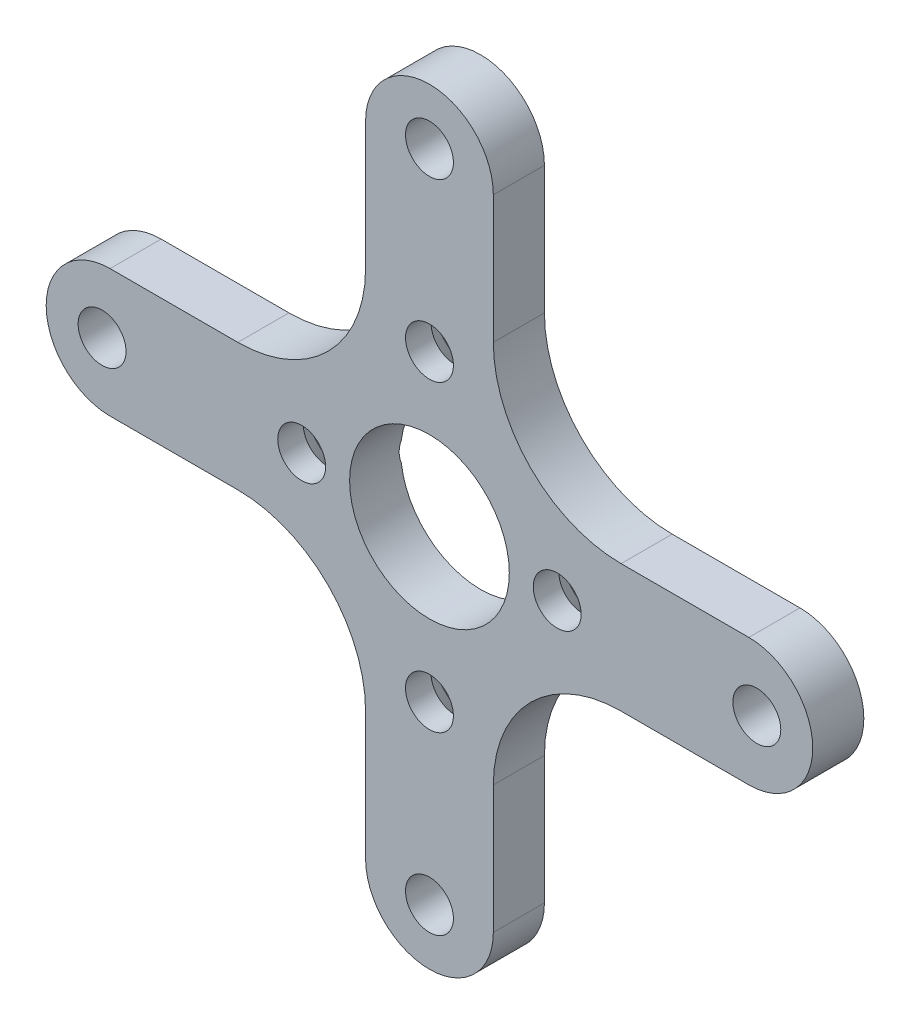
ISO-10303-21;
HEADER;
FILE_DESCRIPTION(('STEP AP214'),'2;1');
FILE_NAME('part.step','',(''),(''),'','','');
FILE_SCHEMA(('AUTOMOTIVE_DESIGN { 1 0 10303 214 1 1 1 1 }'));
ENDSEC;
DATA;
#1=APPLICATION_CONTEXT('core data for automotive mechanical design processes');
#2=APPLICATION_PROTOCOL_DEFINITION('international standard','automotive_design',2000,#1);
#3=PRODUCT_CONTEXT('',#1,'mechanical');
#4=PRODUCT('Part','Part','',(#3));
#5=PRODUCT_RELATED_PRODUCT_CATEGORY('part','',(#4));
#6=PRODUCT_DEFINITION_FORMATION('','',#4);
#7=PRODUCT_DEFINITION_CONTEXT('part definition',#1,'design');
#8=PRODUCT_DEFINITION('design','',#6,#7);
#9=PRODUCT_DEFINITION_SHAPE('','',#8);
#10=(LENGTH_UNIT() NAMED_UNIT(*) SI_UNIT(.MILLI.,.METRE.));
#11=(NAMED_UNIT(*) PLANE_ANGLE_UNIT() SI_UNIT($,.RADIAN.));
#12=(NAMED_UNIT(*) SI_UNIT($,.STERADIAN.) SOLID_ANGLE_UNIT());
#13=UNCERTAINTY_MEASURE_WITH_UNIT(LENGTH_MEASURE(1.E-05),#10,'distance_accuracy_value','');
#14=(GEOMETRIC_REPRESENTATION_CONTEXT(3) GLOBAL_UNCERTAINTY_ASSIGNED_CONTEXT((#13)) GLOBAL_UNIT_ASSIGNED_CONTEXT((#10,
#11,#12)) REPRESENTATION_CONTEXT('',''));
#15=CARTESIAN_POINT('',(0.,0.,0.));
#16=DIRECTION('',(0.,0.,1.));
#17=DIRECTION('',(1.,0.,0.));
#18=AXIS2_PLACEMENT_3D('',#15,#16,#17);
#19=CARTESIAN_POINT('',(0.,20.,3.2));
#20=DIRECTION('',(0.,0.,-1.));
#21=DIRECTION('',(-1.,0.,0.));
#22=AXIS2_PLACEMENT_3D('',#19,#20,#21);
#23=PLANE('',#22);
#24=CARTESIAN_POINT('',(0.,20.,3.2));
#25=DIRECTION('',(0.,0.,1.));
#26=DIRECTION('',(-1.,0.,0.));
#27=AXIS2_PLACEMENT_3D('',#24,#25,#26);
#28=CIRCLE('',#27,4.);
#29=CARTESIAN_POINT('',(4.,20.,3.2));
#30=VERTEX_POINT('',#29);
#31=CARTESIAN_POINT('',(-4.,20.,3.2));
#32=VERTEX_POINT('',#31);
#33=EDGE_CURVE('E172',#30,#32,#28,.T.);
#34=ORIENTED_EDGE('',*,*,#33,.T.);
#35=DIRECTION('',(0.,-1.,0.));
#36=VECTOR('',#35,1.);
#37=CARTESIAN_POINT('',(-4.,20.,3.2));
#38=LINE('',#37,#36);
#39=CARTESIAN_POINT('',(-4.,12.,3.2));
#40=VERTEX_POINT('',#39);
#41=EDGE_CURVE('E161',#32,#40,#38,.T.);
#42=ORIENTED_EDGE('',*,*,#41,.T.);
#43=CARTESIAN_POINT('',(-12.,12.,3.2));
#44=DIRECTION('',(0.,0.,-1.));
#45=DIRECTION('',(-1.,0.,0.));
#46=AXIS2_PLACEMENT_3D('',#43,#44,#45);
#47=CIRCLE('',#46,8.);
#48=CARTESIAN_POINT('',(-12.,4.,3.2));
#49=VERTEX_POINT('',#48);
#50=EDGE_CURVE('E171',#40,#49,#47,.T.);
#51=ORIENTED_EDGE('',*,*,#50,.T.);
#52=DIRECTION('',(-1.,0.,0.));
#53=VECTOR('',#52,1.);
#54=CARTESIAN_POINT('',(-12.,4.,3.2));
#55=LINE('',#54,#53);
#56=CARTESIAN_POINT('',(-20.,4.,3.2));
#57=VERTEX_POINT('',#56);
#58=EDGE_CURVE('E344',#49,#57,#55,.T.);
#59=ORIENTED_EDGE('',*,*,#58,.T.);
#60=CARTESIAN_POINT('',(-20.,0.,3.2));
#61=DIRECTION('',(0.,0.,1.));
#62=DIRECTION('',(1.,0.,0.));
#63=AXIS2_PLACEMENT_3D('',#60,#61,#62);
#64=CIRCLE('',#63,4.);
#65=CARTESIAN_POINT('',(-20.,-4.,3.2));
#66=VERTEX_POINT('',#65);
#67=EDGE_CURVE('E346',#57,#66,#64,.T.);
#68=ORIENTED_EDGE('',*,*,#67,.T.);
#69=DIRECTION('',(1.,0.,0.));
#70=VECTOR('',#69,1.);
#71=CARTESIAN_POINT('',(-20.,-4.,3.2));
#72=LINE('',#71,#70);
#73=CARTESIAN_POINT('',(-12.,-4.,3.2));
#74=VERTEX_POINT('',#73);
#75=EDGE_CURVE('E348',#66,#74,#72,.T.);
#76=ORIENTED_EDGE('',*,*,#75,.T.);
#77=CARTESIAN_POINT('',(-12.,-12.,3.2));
#78=DIRECTION('',(0.,0.,-1.));
#79=DIRECTION('',(-1.,0.,0.));
#80=AXIS2_PLACEMENT_3D('',#77,#78,#79);
#81=CIRCLE('',#80,8.);
#82=CARTESIAN_POINT('',(-4.,-12.,3.2));
#83=VERTEX_POINT('',#82);
#84=EDGE_CURVE('E350',#74,#83,#81,.T.);
#85=ORIENTED_EDGE('',*,*,#84,.T.);
#86=DIRECTION('',(0.,-1.,0.));
#87=VECTOR('',#86,1.);
#88=CARTESIAN_POINT('',(-4.,-12.,3.2));
#89=LINE('',#88,#87);
#90=CARTESIAN_POINT('',(-4.,-20.,3.2));
#91=VERTEX_POINT('',#90);
#92=EDGE_CURVE('E352',#83,#91,#89,.T.);
#93=ORIENTED_EDGE('',*,*,#92,.T.);
#94=CARTESIAN_POINT('',(0.,-20.,3.2));
#95=DIRECTION('',(0.,0.,1.));
#96=DIRECTION('',(1.,0.,0.));
#97=AXIS2_PLACEMENT_3D('',#94,#95,#96);
#98=CIRCLE('',#97,4.);
#99=CARTESIAN_POINT('',(4.,-20.,3.2));
#100=VERTEX_POINT('',#99);
#101=EDGE_CURVE('E354',#91,#100,#98,.T.);
#102=ORIENTED_EDGE('',*,*,#101,.T.);
#103=DIRECTION('',(0.,1.,0.));
#104=VECTOR('',#103,1.);
#105=CARTESIAN_POINT('',(4.,-20.,3.2));
#106=LINE('',#105,#104);
#107=CARTESIAN_POINT('',(4.00000000000001,-12.,3.2));
#108=VERTEX_POINT('',#107);
#109=EDGE_CURVE('E356',#100,#108,#106,.T.);
#110=ORIENTED_EDGE('',*,*,#109,.T.);
#111=CARTESIAN_POINT('',(12.,-12.,3.2));
#112=DIRECTION('',(0.,0.,-1.));
#113=DIRECTION('',(-1.,0.,0.));
#114=AXIS2_PLACEMENT_3D('',#111,#112,#113);
#115=CIRCLE('',#114,8.);
#116=CARTESIAN_POINT('',(12.,-4.,3.2));
#117=VERTEX_POINT('',#116);
#118=EDGE_CURVE('E358',#108,#117,#115,.T.);
#119=ORIENTED_EDGE('',*,*,#118,.T.);
#120=DIRECTION('',(1.,0.,0.));
#121=VECTOR('',#120,1.);
#122=CARTESIAN_POINT('',(12.,-4.,3.2));
#123=LINE('',#122,#121);
#124=CARTESIAN_POINT('',(20.,-4.,3.2));
#125=VERTEX_POINT('',#124);
#126=EDGE_CURVE('E360',#117,#125,#123,.T.);
#127=ORIENTED_EDGE('',*,*,#126,.T.);
#128=CARTESIAN_POINT('',(20.,0.,3.2));
#129=DIRECTION('',(0.,0.,1.));
#130=DIRECTION('',(-1.,0.,0.));
#131=AXIS2_PLACEMENT_3D('',#128,#129,#130);
#132=CIRCLE('',#131,4.);
#133=CARTESIAN_POINT('',(20.,4.,3.2));
#134=VERTEX_POINT('',#133);
#135=EDGE_CURVE('E362',#125,#134,#132,.T.);
#136=ORIENTED_EDGE('',*,*,#135,.T.);
#137=DIRECTION('',(-1.,0.,0.));
#138=VECTOR('',#137,1.);
#139=CARTESIAN_POINT('',(12.,4.,3.2));
#140=LINE('',#139,#138);
#141=CARTESIAN_POINT('',(12.,4.,3.2));
#142=VERTEX_POINT('',#141);
#143=EDGE_CURVE('E364',#134,#142,#140,.T.);
#144=ORIENTED_EDGE('',*,*,#143,.T.);
#145=CARTESIAN_POINT('',(12.,12.,3.2));
#146=DIRECTION('',(0.,0.,-1.));
#147=DIRECTION('',(1.,0.,0.));
#148=AXIS2_PLACEMENT_3D('',#145,#146,#147);
#149=CIRCLE('',#148,8.);
#150=CARTESIAN_POINT('',(4.,12.,3.2));
#151=VERTEX_POINT('',#150);
#152=EDGE_CURVE('E366',#142,#151,#149,.T.);
#153=ORIENTED_EDGE('',*,*,#152,.T.);
#154=DIRECTION('',(0.,1.,0.));
#155=VECTOR('',#154,1.);
#156=CARTESIAN_POINT('',(4.,20.,3.2));
#157=LINE('',#156,#155);
#158=EDGE_CURVE('E177',#151,#30,#157,.T.);
#159=ORIENTED_EDGE('',*,*,#158,.T.);
#160=EDGE_LOOP('',(#34,#42,#51,#59,#68,#76,#85,#93,#102,#110,#119,#127,#136,#144,#153,#159));
#161=FACE_BOUND('',#160,.T.);
#162=CARTESIAN_POINT('',(0.,20.5,3.2));
#163=DIRECTION('',(0.,0.,1.));
#164=DIRECTION('',(1.,0.,0.));
#165=AXIS2_PLACEMENT_3D('',#162,#163,#164);
#166=CIRCLE('',#165,1.5);
#167=CARTESIAN_POINT('',(1.5,20.5,3.2));
#168=VERTEX_POINT('',#167);
#169=EDGE_CURVE('E338',#168,#168,#166,.T.);
#170=ORIENTED_EDGE('',*,*,#169,.F.);
#171=EDGE_LOOP('',(#170));
#172=FACE_BOUND('',#171,.T.);
#173=CARTESIAN_POINT('',(20.5,0.,3.2));
#174=DIRECTION('',(0.,0.,1.));
#175=DIRECTION('',(1.,0.,0.));
#176=AXIS2_PLACEMENT_3D('',#173,#174,#175);
#177=CIRCLE('',#176,1.5);
#178=CARTESIAN_POINT('',(22.,0.,3.2));
#179=VERTEX_POINT('',#178);
#180=EDGE_CURVE('E332',#179,#179,#177,.T.);
#181=ORIENTED_EDGE('',*,*,#180,.F.);
#182=EDGE_LOOP('',(#181));
#183=FACE_BOUND('',#182,.T.);
#184=CARTESIAN_POINT('',(0.,0.,3.2));
#185=DIRECTION('',(0.,0.,1.));
#186=DIRECTION('',(1.,0.,0.));
#187=AXIS2_PLACEMENT_3D('',#184,#185,#186);
#188=CIRCLE('',#187,5.);
#189=CARTESIAN_POINT('',(5.,0.,3.2));
#190=VERTEX_POINT('',#189);
#191=EDGE_CURVE('E324',#190,#190,#188,.T.);
#192=ORIENTED_EDGE('',*,*,#191,.F.);
#193=EDGE_LOOP('',(#192));
#194=FACE_BOUND('',#193,.T.);
#195=CARTESIAN_POINT('',(0.,9.5,3.2));
#196=DIRECTION('',(0.,0.,1.));
#197=DIRECTION('',(1.,0.,0.));
#198=AXIS2_PLACEMENT_3D('',#195,#196,#197);
#199=CIRCLE('',#198,1.5);
#200=CARTESIAN_POINT('',(1.5,9.5,3.2));
#201=VERTEX_POINT('',#200);
#202=EDGE_CURVE('E329',#201,#201,#199,.T.);
#203=ORIENTED_EDGE('',*,*,#202,.F.);
#204=EDGE_LOOP('',(#203));
#205=FACE_BOUND('',#204,.T.);
#206=CARTESIAN_POINT('',(0.,-9.5,3.2));
#207=DIRECTION('',(0.,0.,1.));
#208=DIRECTION('',(1.,0.,0.));
#209=AXIS2_PLACEMENT_3D('',#206,#207,#208);
#210=CIRCLE('',#209,1.5);
#211=CARTESIAN_POINT('',(1.5,-9.5,3.2));
#212=VERTEX_POINT('',#211);
#213=EDGE_CURVE('E492',#212,#212,#210,.T.);
#214=ORIENTED_EDGE('',*,*,#213,.F.);
#215=EDGE_LOOP('',(#214));
#216=FACE_BOUND('',#215,.T.);
#217=CARTESIAN_POINT('',(-8.,0.,3.2));
#218=DIRECTION('',(0.,0.,1.));
#219=DIRECTION('',(1.,0.,0.));
#220=AXIS2_PLACEMENT_3D('',#217,#218,#219);
#221=CIRCLE('',#220,1.5);
#222=CARTESIAN_POINT('',(-6.5,0.,3.2));
#223=VERTEX_POINT('',#222);
#224=EDGE_CURVE('E496',#223,#223,#221,.T.);
#225=ORIENTED_EDGE('',*,*,#224,.F.);
#226=EDGE_LOOP('',(#225));
#227=FACE_BOUND('',#226,.T.);
#228=CARTESIAN_POINT('',(8.,0.,3.2));
#229=DIRECTION('',(0.,0.,1.));
#230=DIRECTION('',(1.,0.,0.));
#231=AXIS2_PLACEMENT_3D('',#228,#229,#230);
#232=CIRCLE('',#231,1.5);
#233=CARTESIAN_POINT('',(9.5,0.,3.2));
#234=VERTEX_POINT('',#233);
#235=EDGE_CURVE('E500',#234,#234,#232,.T.);
#236=ORIENTED_EDGE('',*,*,#235,.F.);
#237=EDGE_LOOP('',(#236));
#238=FACE_BOUND('',#237,.T.);
#239=CARTESIAN_POINT('',(-20.5,0.,3.2));
#240=DIRECTION('',(0.,0.,1.));
#241=DIRECTION('',(1.,0.,0.));
#242=AXIS2_PLACEMENT_3D('',#239,#240,#241);
#243=CIRCLE('',#242,1.5);
#244=CARTESIAN_POINT('',(-19.,0.,3.2));
#245=VERTEX_POINT('',#244);
#246=EDGE_CURVE('E504',#245,#245,#243,.T.);
#247=ORIENTED_EDGE('',*,*,#246,.F.);
#248=EDGE_LOOP('',(#247));
#249=FACE_BOUND('',#248,.T.);
#250=CARTESIAN_POINT('',(0.,-20.5,3.2));
#251=DIRECTION('',(0.,0.,1.));
#252=DIRECTION('',(1.,0.,0.));
#253=AXIS2_PLACEMENT_3D('',#250,#251,#252);
#254=CIRCLE('',#253,1.5);
#255=CARTESIAN_POINT('',(1.5,-20.5,3.2));
#256=VERTEX_POINT('',#255);
#257=EDGE_CURVE('E507',#256,#256,#254,.T.);
#258=ORIENTED_EDGE('',*,*,#257,.F.);
#259=EDGE_LOOP('',(#258));
#260=FACE_BOUND('',#259,.T.);
#261=ADVANCED_FACE('F34',(#161,#172,#183,#194,#205,#216,#227,#238,#249,#260),#23,.F.);
#262=CARTESIAN_POINT('',(0.,20.,0.));
#263=DIRECTION('',(0.,0.,-1.));
#264=DIRECTION('',(-1.,0.,0.));
#265=AXIS2_PLACEMENT_3D('',#262,#263,#264);
#266=PLANE('',#265);
#267=CARTESIAN_POINT('',(0.,-9.5,0.));
#268=DIRECTION('',(0.,0.,-1.));
#269=DIRECTION('',(-1.,0.,0.));
#270=AXIS2_PLACEMENT_3D('',#267,#268,#269);
#271=CIRCLE('',#270,3.09999999999999);
#272=CARTESIAN_POINT('',(-3.09999999999999,-9.5,0.));
#273=VERTEX_POINT('',#272);
#274=EDGE_CURVE('E199',#273,#273,#271,.F.);
#275=ORIENTED_EDGE('',*,*,#274,.T.);
#276=EDGE_LOOP('',(#275));
#277=FACE_BOUND('',#276,.T.);
#278=CARTESIAN_POINT('',(0.,9.5,0.));
#279=DIRECTION('',(0.,0.,-1.));
#280=DIRECTION('',(-1.,0.,0.));
#281=AXIS2_PLACEMENT_3D('',#278,#279,#280);
#282=CIRCLE('',#281,3.09999999999999);
#283=CARTESIAN_POINT('',(-3.09999999999999,9.5,0.));
#284=VERTEX_POINT('',#283);
#285=EDGE_CURVE('E196',#284,#284,#282,.F.);
#286=ORIENTED_EDGE('',*,*,#285,.T.);
#287=EDGE_LOOP('',(#286));
#288=FACE_BOUND('',#287,.T.);
#289=CARTESIAN_POINT('',(-20.5,0.,0.));
#290=DIRECTION('',(0.,0.,1.));
#291=DIRECTION('',(1.,0.,0.));
#292=AXIS2_PLACEMENT_3D('',#289,#290,#291);
#293=CIRCLE('',#292,1.5);
#294=CARTESIAN_POINT('',(-19.,0.,0.));
#295=VERTEX_POINT('',#294);
#296=EDGE_CURVE('E509',#295,#295,#293,.T.);
#297=ORIENTED_EDGE('',*,*,#296,.T.);
#298=EDGE_LOOP('',(#297));
#299=FACE_BOUND('',#298,.T.);
#300=CARTESIAN_POINT('',(20.5,0.,0.));
#301=DIRECTION('',(0.,0.,1.));
#302=DIRECTION('',(1.,0.,0.));
#303=AXIS2_PLACEMENT_3D('',#300,#301,#302);
#304=CIRCLE('',#303,1.5);
#305=CARTESIAN_POINT('',(22.,0.,0.));
#306=VERTEX_POINT('',#305);
#307=EDGE_CURVE('E327',#306,#306,#304,.T.);
#308=ORIENTED_EDGE('',*,*,#307,.T.);
#309=EDGE_LOOP('',(#308));
#310=FACE_BOUND('',#309,.T.);
#311=CARTESIAN_POINT('',(0.,20.,0.));
#312=DIRECTION('',(0.,0.,1.));
#313=DIRECTION('',(-1.,0.,0.));
#314=AXIS2_PLACEMENT_3D('',#311,#312,#313);
#315=CIRCLE('',#314,4.);
#316=CARTESIAN_POINT('',(4.,20.,0.));
#317=VERTEX_POINT('',#316);
#318=CARTESIAN_POINT('',(-4.,20.,0.));
#319=VERTEX_POINT('',#318);
#320=EDGE_CURVE('E185',#317,#319,#315,.T.);
#321=ORIENTED_EDGE('',*,*,#320,.F.);
#322=DIRECTION('',(0.,1.,0.));
#323=VECTOR('',#322,1.);
#324=CARTESIAN_POINT('',(4.,20.,0.));
#325=LINE('',#324,#323);
#326=CARTESIAN_POINT('',(4.,12.,0.));
#327=VERTEX_POINT('',#326);
#328=EDGE_CURVE('E181',#327,#317,#325,.T.);
#329=ORIENTED_EDGE('',*,*,#328,.F.);
#330=CARTESIAN_POINT('',(12.,12.,0.));
#331=DIRECTION('',(0.,0.,-1.));
#332=DIRECTION('',(1.,0.,0.));
#333=AXIS2_PLACEMENT_3D('',#330,#331,#332);
#334=CIRCLE('',#333,8.);
#335=CARTESIAN_POINT('',(12.,4.,0.));
#336=VERTEX_POINT('',#335);
#337=EDGE_CURVE('E397',#336,#327,#334,.T.);
#338=ORIENTED_EDGE('',*,*,#337,.F.);
#339=DIRECTION('',(-1.,0.,0.));
#340=VECTOR('',#339,1.);
#341=CARTESIAN_POINT('',(12.,4.,0.));
#342=LINE('',#341,#340);
#343=CARTESIAN_POINT('',(20.,4.,0.));
#344=VERTEX_POINT('',#343);
#345=EDGE_CURVE('E395',#344,#336,#342,.T.);
#346=ORIENTED_EDGE('',*,*,#345,.F.);
#347=CARTESIAN_POINT('',(20.,0.,0.));
#348=DIRECTION('',(0.,0.,1.));
#349=DIRECTION('',(-1.,0.,0.));
#350=AXIS2_PLACEMENT_3D('',#347,#348,#349);
#351=CIRCLE('',#350,4.);
#352=CARTESIAN_POINT('',(20.,-4.,0.));
#353=VERTEX_POINT('',#352);
#354=EDGE_CURVE('E393',#353,#344,#351,.T.);
#355=ORIENTED_EDGE('',*,*,#354,.F.);
#356=DIRECTION('',(1.,0.,0.));
#357=VECTOR('',#356,1.);
#358=CARTESIAN_POINT('',(12.,-4.,0.));
#359=LINE('',#358,#357);
#360=CARTESIAN_POINT('',(12.,-4.,0.));
#361=VERTEX_POINT('',#360);
#362=EDGE_CURVE('E391',#361,#353,#359,.T.);
#363=ORIENTED_EDGE('',*,*,#362,.F.);
#364=CARTESIAN_POINT('',(12.,-12.,0.));
#365=DIRECTION('',(0.,0.,-1.));
#366=DIRECTION('',(-1.,0.,0.));
#367=AXIS2_PLACEMENT_3D('',#364,#365,#366);
#368=CIRCLE('',#367,8.);
#369=CARTESIAN_POINT('',(4.00000000000001,-12.,0.));
#370=VERTEX_POINT('',#369);
#371=EDGE_CURVE('E389',#370,#361,#368,.T.);
#372=ORIENTED_EDGE('',*,*,#371,.F.);
#373=DIRECTION('',(0.,1.,0.));
#374=VECTOR('',#373,1.);
#375=CARTESIAN_POINT('',(4.,-20.,0.));
#376=LINE('',#375,#374);
#377=CARTESIAN_POINT('',(4.,-20.,0.));
#378=VERTEX_POINT('',#377);
#379=EDGE_CURVE('E387',#378,#370,#376,.T.);
#380=ORIENTED_EDGE('',*,*,#379,.F.);
#381=CARTESIAN_POINT('',(0.,-20.,0.));
#382=DIRECTION('',(0.,0.,1.));
#383=DIRECTION('',(1.,0.,0.));
#384=AXIS2_PLACEMENT_3D('',#381,#382,#383);
#385=CIRCLE('',#384,4.);
#386=CARTESIAN_POINT('',(-4.,-20.,0.));
#387=VERTEX_POINT('',#386);
#388=EDGE_CURVE('E385',#387,#378,#385,.T.);
#389=ORIENTED_EDGE('',*,*,#388,.F.);
#390=DIRECTION('',(0.,-1.,0.));
#391=VECTOR('',#390,1.);
#392=CARTESIAN_POINT('',(-4.,-12.,0.));
#393=LINE('',#392,#391);
#394=CARTESIAN_POINT('',(-4.,-12.,0.));
#395=VERTEX_POINT('',#394);
#396=EDGE_CURVE('E383',#395,#387,#393,.T.);
#397=ORIENTED_EDGE('',*,*,#396,.F.);
#398=CARTESIAN_POINT('',(-12.,-12.,0.));
#399=DIRECTION('',(0.,0.,-1.));
#400=DIRECTION('',(-1.,0.,0.));
#401=AXIS2_PLACEMENT_3D('',#398,#399,#400);
#402=CIRCLE('',#401,8.);
#403=CARTESIAN_POINT('',(-12.,-4.,0.));
#404=VERTEX_POINT('',#403);
#405=EDGE_CURVE('E381',#404,#395,#402,.T.);
#406=ORIENTED_EDGE('',*,*,#405,.F.);
#407=DIRECTION('',(1.,0.,0.));
#408=VECTOR('',#407,1.);
#409=CARTESIAN_POINT('',(-20.,-4.,0.));
#410=LINE('',#409,#408);
#411=CARTESIAN_POINT('',(-20.,-4.,0.));
#412=VERTEX_POINT('',#411);
#413=EDGE_CURVE('E379',#412,#404,#410,.T.);
#414=ORIENTED_EDGE('',*,*,#413,.F.);
#415=CARTESIAN_POINT('',(-20.,0.,0.));
#416=DIRECTION('',(0.,0.,1.));
#417=DIRECTION('',(1.,0.,0.));
#418=AXIS2_PLACEMENT_3D('',#415,#416,#417);
#419=CIRCLE('',#418,4.);
#420=CARTESIAN_POINT('',(-20.,4.,0.));
#421=VERTEX_POINT('',#420);
#422=EDGE_CURVE('E377',#421,#412,#419,.T.);
#423=ORIENTED_EDGE('',*,*,#422,.F.);
#424=DIRECTION('',(-1.,0.,0.));
#425=VECTOR('',#424,1.);
#426=CARTESIAN_POINT('',(-12.,4.,0.));
#427=LINE('',#426,#425);
#428=CARTESIAN_POINT('',(-12.,4.,0.));
#429=VERTEX_POINT('',#428);
#430=EDGE_CURVE('E375',#429,#421,#427,.T.);
#431=ORIENTED_EDGE('',*,*,#430,.F.);
#432=CARTESIAN_POINT('',(-12.,12.,0.));
#433=DIRECTION('',(0.,0.,-1.));
#434=DIRECTION('',(-1.,0.,0.));
#435=AXIS2_PLACEMENT_3D('',#432,#433,#434);
#436=CIRCLE('',#435,8.);
#437=CARTESIAN_POINT('',(-4.,12.,0.));
#438=VERTEX_POINT('',#437);
#439=EDGE_CURVE('E373',#438,#429,#436,.T.);
#440=ORIENTED_EDGE('',*,*,#439,.F.);
#441=DIRECTION('',(0.,-1.,0.));
#442=VECTOR('',#441,1.);
#443=CARTESIAN_POINT('',(-4.,20.,0.));
#444=LINE('',#443,#442);
#445=EDGE_CURVE('E371',#319,#438,#444,.T.);
#446=ORIENTED_EDGE('',*,*,#445,.F.);
#447=EDGE_LOOP('',(#321,#329,#338,#346,#355,#363,#372,#380,#389,#397,#406,#414,#423,#431,#440,#446));
#448=FACE_BOUND('',#447,.T.);
#449=CARTESIAN_POINT('',(0.,20.5,0.));
#450=DIRECTION('',(0.,0.,1.));
#451=DIRECTION('',(1.,0.,0.));
#452=AXIS2_PLACEMENT_3D('',#449,#450,#451);
#453=CIRCLE('',#452,1.5);
#454=CARTESIAN_POINT('',(1.5,20.5,0.));
#455=VERTEX_POINT('',#454);
#456=EDGE_CURVE('E335',#455,#455,#453,.T.);
#457=ORIENTED_EDGE('',*,*,#456,.T.);
#458=EDGE_LOOP('',(#457));
#459=FACE_BOUND('',#458,.T.);
#460=CARTESIAN_POINT('',(0.,0.,0.));
#461=DIRECTION('',(0.,0.,1.));
#462=DIRECTION('',(1.,0.,0.));
#463=AXIS2_PLACEMENT_3D('',#460,#461,#462);
#464=CIRCLE('',#463,5.);
#465=CARTESIAN_POINT('',(4.96187499999999,0.616276305219592,0.));
#466=VERTEX_POINT('',#465);
#467=CARTESIAN_POINT('',(-4.961875,0.616276305219537,0.));
#468=VERTEX_POINT('',#467);
#469=EDGE_CURVE('E319',#466,#468,#464,.T.);
#470=ORIENTED_EDGE('',*,*,#469,.T.);
#471=CARTESIAN_POINT('',(-8.,0.,0.));
#472=DIRECTION('',(0.,0.,-1.));
#473=DIRECTION('',(-1.,0.,0.));
#474=AXIS2_PLACEMENT_3D('',#471,#472,#473);
#475=CIRCLE('',#474,3.10000000000001);
#476=CARTESIAN_POINT('',(-4.961875,-0.616276305219537,0.));
#477=VERTEX_POINT('',#476);
#478=EDGE_CURVE('E189',#468,#477,#475,.F.);
#479=ORIENTED_EDGE('',*,*,#478,.T.);
#480=CARTESIAN_POINT('',(4.96187499999999,-0.616276305219592,0.));
#481=VERTEX_POINT('',#480);
#482=EDGE_CURVE('E320',#477,#481,#464,.T.);
#483=ORIENTED_EDGE('',*,*,#482,.T.);
#484=CARTESIAN_POINT('',(8.,0.,0.));
#485=DIRECTION('',(0.,0.,-1.));
#486=DIRECTION('',(-1.,0.,0.));
#487=AXIS2_PLACEMENT_3D('',#484,#485,#486);
#488=CIRCLE('',#487,3.10000000000003);
#489=EDGE_CURVE('E186',#481,#466,#488,.F.);
#490=ORIENTED_EDGE('',*,*,#489,.T.);
#491=EDGE_LOOP('',(#470,#479,#483,#490));
#492=FACE_BOUND('',#491,.T.);
#493=CARTESIAN_POINT('',(0.,-20.5,0.));
#494=DIRECTION('',(0.,0.,1.));
#495=DIRECTION('',(1.,0.,0.));
#496=AXIS2_PLACEMENT_3D('',#493,#494,#495);
#497=CIRCLE('',#496,1.5);
#498=CARTESIAN_POINT('',(1.5,-20.5,0.));
#499=VERTEX_POINT('',#498);
#500=EDGE_CURVE('E510',#499,#499,#497,.T.);
#501=ORIENTED_EDGE('',*,*,#500,.T.);
#502=EDGE_LOOP('',(#501));
#503=FACE_BOUND('',#502,.T.);
#504=ADVANCED_FACE('F236',(#277,#288,#299,#310,#448,#459,#492,#503),#266,.T.);
#505=CARTESIAN_POINT('',(0.,20.,3.2));
#506=DIRECTION('',(0.,0.,-1.));
#507=DIRECTION('',(-1.,0.,0.));
#508=AXIS2_PLACEMENT_3D('',#505,#506,#507);
#509=CYLINDRICAL_SURFACE('',#508,4.);
#510=ORIENTED_EDGE('',*,*,#320,.T.);
#511=DIRECTION('',(0.,0.,-1.));
#512=VECTOR('',#511,1.);
#513=CARTESIAN_POINT('',(-4.,20.,3.2));
#514=LINE('',#513,#512);
#515=EDGE_CURVE('E165',#32,#319,#514,.T.);
#516=ORIENTED_EDGE('',*,*,#515,.F.);
#517=ORIENTED_EDGE('',*,*,#33,.F.);
#518=DIRECTION('',(0.,0.,-1.));
#519=VECTOR('',#518,1.);
#520=CARTESIAN_POINT('',(4.,20.,3.2));
#521=LINE('',#520,#519);
#522=EDGE_CURVE('E369',#30,#317,#521,.T.);
#523=ORIENTED_EDGE('',*,*,#522,.T.);
#524=EDGE_LOOP('',(#510,#516,#517,#523));
#525=FACE_BOUND('',#524,.T.);
#526=ADVANCED_FACE('F183',(#525),#509,.T.);
#527=CARTESIAN_POINT('',(-4.,20.,3.2));
#528=DIRECTION('',(1.,0.,0.));
#529=DIRECTION('',(0.,1.,0.));
#530=AXIS2_PLACEMENT_3D('',#527,#528,#529);
#531=PLANE('',#530);
#532=ORIENTED_EDGE('',*,*,#445,.T.);
#533=DIRECTION('',(0.,0.,-1.));
#534=VECTOR('',#533,1.);
#535=CARTESIAN_POINT('',(-4.,12.,3.2));
#536=LINE('',#535,#534);
#537=EDGE_CURVE('E168',#40,#438,#536,.T.);
#538=ORIENTED_EDGE('',*,*,#537,.F.);
#539=ORIENTED_EDGE('',*,*,#41,.F.);
#540=ORIENTED_EDGE('',*,*,#515,.T.);
#541=EDGE_LOOP('',(#532,#538,#539,#540));
#542=FACE_BOUND('',#541,.T.);
#543=ADVANCED_FACE('F163',(#542),#531,.F.);
#544=CARTESIAN_POINT('',(-12.,12.,3.2));
#545=DIRECTION('',(0.,0.,-1.));
#546=DIRECTION('',(-1.,0.,0.));
#547=AXIS2_PLACEMENT_3D('',#544,#545,#546);
#548=CYLINDRICAL_SURFACE('',#547,8.);
#549=ORIENTED_EDGE('',*,*,#439,.T.);
#550=DIRECTION('',(0.,0.,-1.));
#551=VECTOR('',#550,1.);
#552=CARTESIAN_POINT('',(-12.,4.,3.2));
#553=LINE('',#552,#551);
#554=EDGE_CURVE('E191',#49,#429,#553,.T.);
#555=ORIENTED_EDGE('',*,*,#554,.F.);
#556=ORIENTED_EDGE('',*,*,#50,.F.);
#557=ORIENTED_EDGE('',*,*,#537,.T.);
#558=EDGE_LOOP('',(#549,#555,#556,#557));
#559=FACE_BOUND('',#558,.T.);
#560=ADVANCED_FACE('F290',(#559),#548,.F.);
#561=CARTESIAN_POINT('',(-12.,4.,3.2));
#562=DIRECTION('',(0.,-1.,0.));
#563=DIRECTION('',(1.,0.,0.));
#564=AXIS2_PLACEMENT_3D('',#561,#562,#563);
#565=PLANE('',#564);
#566=ORIENTED_EDGE('',*,*,#430,.T.);
#567=DIRECTION('',(0.,0.,-1.));
#568=VECTOR('',#567,1.);
#569=CARTESIAN_POINT('',(-20.,4.,3.2));
#570=LINE('',#569,#568);
#571=EDGE_CURVE('E434',#57,#421,#570,.T.);
#572=ORIENTED_EDGE('',*,*,#571,.F.);
#573=ORIENTED_EDGE('',*,*,#58,.F.);
#574=ORIENTED_EDGE('',*,*,#554,.T.);
#575=EDGE_LOOP('',(#566,#572,#573,#574));
#576=FACE_BOUND('',#575,.T.);
#577=ADVANCED_FACE('F286',(#576),#565,.F.);
#578=CARTESIAN_POINT('',(-20.,0.,3.2));
#579=DIRECTION('',(0.,0.,-1.));
#580=DIRECTION('',(-1.,0.,0.));
#581=AXIS2_PLACEMENT_3D('',#578,#579,#580);
#582=CYLINDRICAL_SURFACE('',#581,4.);
#583=ORIENTED_EDGE('',*,*,#422,.T.);
#584=DIRECTION('',(0.,0.,-1.));
#585=VECTOR('',#584,1.);
#586=CARTESIAN_POINT('',(-20.,-4.,3.2));
#587=LINE('',#586,#585);
#588=EDGE_CURVE('E431',#66,#412,#587,.T.);
#589=ORIENTED_EDGE('',*,*,#588,.F.);
#590=ORIENTED_EDGE('',*,*,#67,.F.);
#591=ORIENTED_EDGE('',*,*,#571,.T.);
#592=EDGE_LOOP('',(#583,#589,#590,#591));
#593=FACE_BOUND('',#592,.T.);
#594=ADVANCED_FACE('F282',(#593),#582,.T.);
#595=CARTESIAN_POINT('',(-20.,-4.,3.2));
#596=DIRECTION('',(0.,1.,0.));
#597=DIRECTION('',(-1.,0.,0.));
#598=AXIS2_PLACEMENT_3D('',#595,#596,#597);
#599=PLANE('',#598);
#600=ORIENTED_EDGE('',*,*,#413,.T.);
#601=DIRECTION('',(0.,0.,-1.));
#602=VECTOR('',#601,1.);
#603=CARTESIAN_POINT('',(-12.,-4.,3.2));
#604=LINE('',#603,#602);
#605=EDGE_CURVE('E428',#74,#404,#604,.T.);
#606=ORIENTED_EDGE('',*,*,#605,.F.);
#607=ORIENTED_EDGE('',*,*,#75,.F.);
#608=ORIENTED_EDGE('',*,*,#588,.T.);
#609=EDGE_LOOP('',(#600,#606,#607,#608));
#610=FACE_BOUND('',#609,.T.);
#611=ADVANCED_FACE('F278',(#610),#599,.F.);
#612=CARTESIAN_POINT('',(-12.,-12.,3.2));
#613=DIRECTION('',(0.,0.,-1.));
#614=DIRECTION('',(-1.,0.,0.));
#615=AXIS2_PLACEMENT_3D('',#612,#613,#614);
#616=CYLINDRICAL_SURFACE('',#615,8.);
#617=ORIENTED_EDGE('',*,*,#405,.T.);
#618=DIRECTION('',(0.,0.,-1.));
#619=VECTOR('',#618,1.);
#620=CARTESIAN_POINT('',(-4.,-12.,3.2));
#621=LINE('',#620,#619);
#622=EDGE_CURVE('E425',#83,#395,#621,.T.);
#623=ORIENTED_EDGE('',*,*,#622,.F.);
#624=ORIENTED_EDGE('',*,*,#84,.F.);
#625=ORIENTED_EDGE('',*,*,#605,.T.);
#626=EDGE_LOOP('',(#617,#623,#624,#625));
#627=FACE_BOUND('',#626,.T.);
#628=ADVANCED_FACE('F274',(#627),#616,.F.);
#629=CARTESIAN_POINT('',(-4.,-12.,3.2));
#630=DIRECTION('',(1.,0.,0.));
#631=DIRECTION('',(0.,1.,0.));
#632=AXIS2_PLACEMENT_3D('',#629,#630,#631);
#633=PLANE('',#632);
#634=ORIENTED_EDGE('',*,*,#396,.T.);
#635=DIRECTION('',(0.,0.,-1.));
#636=VECTOR('',#635,1.);
#637=CARTESIAN_POINT('',(-4.,-20.,3.2));
#638=LINE('',#637,#636);
#639=EDGE_CURVE('E422',#91,#387,#638,.T.);
#640=ORIENTED_EDGE('',*,*,#639,.F.);
#641=ORIENTED_EDGE('',*,*,#92,.F.);
#642=ORIENTED_EDGE('',*,*,#622,.T.);
#643=EDGE_LOOP('',(#634,#640,#641,#642));
#644=FACE_BOUND('',#643,.T.);
#645=ADVANCED_FACE('F270',(#644),#633,.F.);
#646=CARTESIAN_POINT('',(0.,-20.,3.2));
#647=DIRECTION('',(0.,0.,-1.));
#648=DIRECTION('',(-1.,0.,0.));
#649=AXIS2_PLACEMENT_3D('',#646,#647,#648);
#650=CYLINDRICAL_SURFACE('',#649,4.);
#651=ORIENTED_EDGE('',*,*,#388,.T.);
#652=DIRECTION('',(0.,0.,-1.));
#653=VECTOR('',#652,1.);
#654=CARTESIAN_POINT('',(4.,-20.,3.2));
#655=LINE('',#654,#653);
#656=EDGE_CURVE('E419',#100,#378,#655,.T.);
#657=ORIENTED_EDGE('',*,*,#656,.F.);
#658=ORIENTED_EDGE('',*,*,#101,.F.);
#659=ORIENTED_EDGE('',*,*,#639,.T.);
#660=EDGE_LOOP('',(#651,#657,#658,#659));
#661=FACE_BOUND('',#660,.T.);
#662=ADVANCED_FACE('F266',(#661),#650,.T.);
#663=CARTESIAN_POINT('',(4.,-20.,3.2));
#664=DIRECTION('',(-1.,0.,0.));
#665=DIRECTION('',(0.,-1.,0.));
#666=AXIS2_PLACEMENT_3D('',#663,#664,#665);
#667=PLANE('',#666);
#668=ORIENTED_EDGE('',*,*,#379,.T.);
#669=DIRECTION('',(0.,0.,-1.));
#670=VECTOR('',#669,1.);
#671=CARTESIAN_POINT('',(4.00000000000001,-12.,3.2));
#672=LINE('',#671,#670);
#673=EDGE_CURVE('E416',#108,#370,#672,.T.);
#674=ORIENTED_EDGE('',*,*,#673,.F.);
#675=ORIENTED_EDGE('',*,*,#109,.F.);
#676=ORIENTED_EDGE('',*,*,#656,.T.);
#677=EDGE_LOOP('',(#668,#674,#675,#676));
#678=FACE_BOUND('',#677,.T.);
#679=ADVANCED_FACE('F262',(#678),#667,.F.);
#680=CARTESIAN_POINT('',(12.,-12.,3.2));
#681=DIRECTION('',(0.,0.,-1.));
#682=DIRECTION('',(-1.,0.,0.));
#683=AXIS2_PLACEMENT_3D('',#680,#681,#682);
#684=CYLINDRICAL_SURFACE('',#683,8.);
#685=ORIENTED_EDGE('',*,*,#371,.T.);
#686=DIRECTION('',(0.,0.,-1.));
#687=VECTOR('',#686,1.);
#688=CARTESIAN_POINT('',(12.,-4.,3.2));
#689=LINE('',#688,#687);
#690=EDGE_CURVE('E413',#117,#361,#689,.T.);
#691=ORIENTED_EDGE('',*,*,#690,.F.);
#692=ORIENTED_EDGE('',*,*,#118,.F.);
#693=ORIENTED_EDGE('',*,*,#673,.T.);
#694=EDGE_LOOP('',(#685,#691,#692,#693));
#695=FACE_BOUND('',#694,.T.);
#696=ADVANCED_FACE('F258',(#695),#684,.F.);
#697=CARTESIAN_POINT('',(12.,-4.,3.2));
#698=DIRECTION('',(0.,1.,0.));
#699=DIRECTION('',(-1.,0.,0.));
#700=AXIS2_PLACEMENT_3D('',#697,#698,#699);
#701=PLANE('',#700);
#702=ORIENTED_EDGE('',*,*,#362,.T.);
#703=DIRECTION('',(0.,0.,-1.));
#704=VECTOR('',#703,1.);
#705=CARTESIAN_POINT('',(20.,-4.,3.2));
#706=LINE('',#705,#704);
#707=EDGE_CURVE('E410',#125,#353,#706,.T.);
#708=ORIENTED_EDGE('',*,*,#707,.F.);
#709=ORIENTED_EDGE('',*,*,#126,.F.);
#710=ORIENTED_EDGE('',*,*,#690,.T.);
#711=EDGE_LOOP('',(#702,#708,#709,#710));
#712=FACE_BOUND('',#711,.T.);
#713=ADVANCED_FACE('F254',(#712),#701,.F.);
#714=CARTESIAN_POINT('',(20.,0.,3.2));
#715=DIRECTION('',(0.,0.,-1.));
#716=DIRECTION('',(-1.,0.,0.));
#717=AXIS2_PLACEMENT_3D('',#714,#715,#716);
#718=CYLINDRICAL_SURFACE('',#717,4.);
#719=ORIENTED_EDGE('',*,*,#354,.T.);
#720=DIRECTION('',(0.,0.,-1.));
#721=VECTOR('',#720,1.);
#722=CARTESIAN_POINT('',(20.,4.,3.2));
#723=LINE('',#722,#721);
#724=EDGE_CURVE('E407',#134,#344,#723,.T.);
#725=ORIENTED_EDGE('',*,*,#724,.F.);
#726=ORIENTED_EDGE('',*,*,#135,.F.);
#727=ORIENTED_EDGE('',*,*,#707,.T.);
#728=EDGE_LOOP('',(#719,#725,#726,#727));
#729=FACE_BOUND('',#728,.T.);
#730=ADVANCED_FACE('F250',(#729),#718,.T.);
#731=CARTESIAN_POINT('',(12.,4.,3.2));
#732=DIRECTION('',(0.,-1.,0.));
#733=DIRECTION('',(1.,0.,0.));
#734=AXIS2_PLACEMENT_3D('',#731,#732,#733);
#735=PLANE('',#734);
#736=ORIENTED_EDGE('',*,*,#345,.T.);
#737=DIRECTION('',(0.,0.,-1.));
#738=VECTOR('',#737,1.);
#739=CARTESIAN_POINT('',(12.,4.,3.2));
#740=LINE('',#739,#738);
#741=EDGE_CURVE('E404',#142,#336,#740,.T.);
#742=ORIENTED_EDGE('',*,*,#741,.F.);
#743=ORIENTED_EDGE('',*,*,#143,.F.);
#744=ORIENTED_EDGE('',*,*,#724,.T.);
#745=EDGE_LOOP('',(#736,#742,#743,#744));
#746=FACE_BOUND('',#745,.T.);
#747=ADVANCED_FACE('F246',(#746),#735,.F.);
#748=CARTESIAN_POINT('',(12.,12.,3.2));
#749=DIRECTION('',(0.,0.,-1.));
#750=DIRECTION('',(-1.,0.,0.));
#751=AXIS2_PLACEMENT_3D('',#748,#749,#750);
#752=CYLINDRICAL_SURFACE('',#751,8.);
#753=ORIENTED_EDGE('',*,*,#337,.T.);
#754=DIRECTION('',(0.,0.,-1.));
#755=VECTOR('',#754,1.);
#756=CARTESIAN_POINT('',(4.,12.,3.2));
#757=LINE('',#756,#755);
#758=EDGE_CURVE('E401',#151,#327,#757,.T.);
#759=ORIENTED_EDGE('',*,*,#758,.F.);
#760=ORIENTED_EDGE('',*,*,#152,.F.);
#761=ORIENTED_EDGE('',*,*,#741,.T.);
#762=EDGE_LOOP('',(#753,#759,#760,#761));
#763=FACE_BOUND('',#762,.T.);
#764=ADVANCED_FACE('F242',(#763),#752,.F.);
#765=CARTESIAN_POINT('',(4.,20.,3.2));
#766=DIRECTION('',(-1.,0.,0.));
#767=DIRECTION('',(0.,-1.,0.));
#768=AXIS2_PLACEMENT_3D('',#765,#766,#767);
#769=PLANE('',#768);
#770=ORIENTED_EDGE('',*,*,#328,.T.);
#771=ORIENTED_EDGE('',*,*,#522,.F.);
#772=ORIENTED_EDGE('',*,*,#158,.F.);
#773=ORIENTED_EDGE('',*,*,#758,.T.);
#774=EDGE_LOOP('',(#770,#771,#772,#773));
#775=FACE_BOUND('',#774,.T.);
#776=ADVANCED_FACE('F232',(#775),#769,.F.);
#777=CARTESIAN_POINT('',(0.,20.5,3.2));
#778=DIRECTION('',(0.,0.,-1.));
#779=DIRECTION('',(-1.,0.,0.));
#780=AXIS2_PLACEMENT_3D('',#777,#778,#779);
#781=CYLINDRICAL_SURFACE('',#780,1.5);
#782=ORIENTED_EDGE('',*,*,#169,.T.);
#783=EDGE_LOOP('',(#782));
#784=FACE_BOUND('',#783,.T.);
#785=ORIENTED_EDGE('',*,*,#456,.F.);
#786=EDGE_LOOP('',(#785));
#787=FACE_BOUND('',#786,.T.);
#788=ADVANCED_FACE('F228',(#784,#787),#781,.F.);
#789=CARTESIAN_POINT('',(20.5,0.,3.2));
#790=DIRECTION('',(0.,0.,-1.));
#791=DIRECTION('',(-1.,0.,0.));
#792=AXIS2_PLACEMENT_3D('',#789,#790,#791);
#793=CYLINDRICAL_SURFACE('',#792,1.5);
#794=ORIENTED_EDGE('',*,*,#180,.T.);
#795=EDGE_LOOP('',(#794));
#796=FACE_BOUND('',#795,.T.);
#797=ORIENTED_EDGE('',*,*,#307,.F.);
#798=EDGE_LOOP('',(#797));
#799=FACE_BOUND('',#798,.T.);
#800=ADVANCED_FACE('F222',(#796,#799),#793,.F.);
#801=CARTESIAN_POINT('',(0.,0.,3.2));
#802=DIRECTION('',(0.,0.,-1.));
#803=DIRECTION('',(-1.,0.,0.));
#804=AXIS2_PLACEMENT_3D('',#801,#802,#803);
#805=CYLINDRICAL_SURFACE('',#804,5.);
#806=ORIENTED_EDGE('',*,*,#191,.T.);
#807=EDGE_LOOP('',(#806));
#808=FACE_BOUND('',#807,.T.);
#809=ORIENTED_EDGE('',*,*,#482,.F.);
#810=CARTESIAN_POINT('',(-4.961875,-0.616276305219537,0.));
#811=CARTESIAN_POINT('',(-4.96810850649813,-0.566127011324952,0.0160903509077163));
#812=CARTESIAN_POINT('',(-4.97364234313382,-0.515318148479445,0.0304931826823298));
#813=CARTESIAN_POINT('',(-4.9832140591331,-0.41258840180753,0.055539599576015));
#814=CARTESIAN_POINT('',(-4.98725028035019,-0.36066635232615,0.0661790172718644));
#815=CARTESIAN_POINT('',(-4.99362302020367,-0.25753289758252,0.0830314052941755));
#816=CARTESIAN_POINT('',(-4.99600505520244,-0.206343956581144,0.0893628057154297));
#817=CARTESIAN_POINT('',(-4.99919057706759,-0.103598416947799,0.097839196146137));
#818=CARTESIAN_POINT('',(-4.99999497778079,-0.0520420485306798,0.0999866097309231));
#819=CARTESIAN_POINT('',(-5.00000498277291,0.051150422198029,0.100013285075433));
#820=CARTESIAN_POINT('',(-4.99920815467063,0.102786526572369,0.0978860533429441));
#821=CARTESIAN_POINT('',(-4.99603275394044,0.20569229139341,0.0894364296531087));
#822=CARTESIAN_POINT('',(-4.99365325935769,0.256961720634238,0.0831115924583965));
#823=CARTESIAN_POINT('',(-4.98728057320219,0.360259468840037,0.0662588959005613));
#824=CARTESIAN_POINT('',(-4.98324164863668,0.412265249695173,0.0556120324905562));
#825=CARTESIAN_POINT('',(-4.97365966442532,0.515159261095745,0.0305382805867328));
#826=CARTESIAN_POINT('',(-4.96811827337563,0.566048664090947,0.016115586030933));
#827=CARTESIAN_POINT('',(-4.961875,0.616276305219537,0.));
#828=B_SPLINE_CURVE_WITH_KNOTS('',3,(#810,#811,#812,#813,#814,#815,#816,#817,#818,#819,#820,
#821,#822,#823,#824,#825,#826,#827),.UNSPECIFIED.,.F.,.F.,(4,2,2,2,2,2,2,2,4),(0.,
0.159114457785196,0.318404563683126,0.473116587405501,0.62773896747847,0.782596407572464,
0.937544136275386,1.09708382863333,1.2564470614237),.UNSPECIFIED.);
#829=EDGE_CURVE('E57',#477,#468,#828,.T.);
#830=ORIENTED_EDGE('',*,*,#829,.T.);
#831=ORIENTED_EDGE('',*,*,#469,.F.);
#832=CARTESIAN_POINT('',(4.96187499999999,0.616276305219592,0.));
#833=CARTESIAN_POINT('',(4.96810850649813,0.566127011325006,0.0160903509077171));
#834=CARTESIAN_POINT('',(4.97364234313381,0.515318148479498,0.0304931826823315));
#835=CARTESIAN_POINT('',(4.98321405913309,0.412588401807581,0.0555395995760187));
#836=CARTESIAN_POINT('',(4.98725028035018,0.3606663523262,0.0661790172718693));
#837=CARTESIAN_POINT('',(4.99362302020367,0.257532897582569,0.083031405294183));
#838=CARTESIAN_POINT('',(4.99600505520243,0.206343956581192,0.0893628057154385));
#839=CARTESIAN_POINT('',(4.99919057706759,0.103598416947845,0.0978391961461486));
#840=CARTESIAN_POINT('',(4.99999497778079,0.0520420485307246,0.0999866097309361));
#841=CARTESIAN_POINT('',(5.00000498277291,-0.0511504221979935,0.100013285075448));
#842=CARTESIAN_POINT('',(4.99920815467063,-0.102786526572342,0.0978860533429593));
#843=CARTESIAN_POINT('',(4.99603275394044,-0.205692291393399,0.0894364296531235));
#844=CARTESIAN_POINT('',(4.99365325935769,-0.256961720634236,0.0831115924584107));
#845=CARTESIAN_POINT('',(4.98728057320219,-0.360259468840052,0.0662588959005733));
#846=CARTESIAN_POINT('',(4.98324164863668,-0.412265249695195,0.0556120324905665));
#847=CARTESIAN_POINT('',(4.97365966442532,-0.515159261095784,0.0305382805867382));
#848=CARTESIAN_POINT('',(4.96811827337563,-0.566048664090995,0.0161155860309352));
#849=CARTESIAN_POINT('',(4.96187499999999,-0.616276305219592,0.));
#850=B_SPLINE_CURVE_WITH_KNOTS('',3,(#832,#833,#834,#835,#836,#837,#838,#839,#840,#841,#842,
#843,#844,#845,#846,#847,#848,#849),.UNSPECIFIED.,.F.,.F.,(4,2,2,2,2,2,2,2,4),(0.,
0.159114457785199,0.318404563683133,0.473116587405511,0.627738967478484,0.782596407572501,
0.937544136275449,1.09708382863342,1.25644706142382),.UNSPECIFIED.);
#851=EDGE_CURVE('E50',#466,#481,#850,.T.);
#852=ORIENTED_EDGE('',*,*,#851,.T.);
#853=EDGE_LOOP('',(#809,#830,#831,#852));
#854=FACE_BOUND('',#853,.T.);
#855=ADVANCED_FACE('F216',(#808,#854),#805,.F.);
#856=CARTESIAN_POINT('',(0.,9.5,3.2));
#857=DIRECTION('',(0.,0.,-1.));
#858=DIRECTION('',(-1.,0.,0.));
#859=AXIS2_PLACEMENT_3D('',#856,#857,#858);
#860=CYLINDRICAL_SURFACE('',#859,1.5);
#861=CARTESIAN_POINT('',(0.,9.5,1.59999999999999));
#862=DIRECTION('',(0.,0.,-1.));
#863=DIRECTION('',(-1.,0.,0.));
#864=AXIS2_PLACEMENT_3D('',#861,#862,#863);
#865=CIRCLE('',#864,1.5);
#866=CARTESIAN_POINT('',(-1.5,9.5,1.59999999999999));
#867=VERTEX_POINT('',#866);
#868=EDGE_CURVE('E205',#867,#867,#865,.T.);
#869=ORIENTED_EDGE('',*,*,#868,.T.);
#870=EDGE_LOOP('',(#869));
#871=FACE_BOUND('',#870,.T.);
#872=ORIENTED_EDGE('',*,*,#202,.T.);
#873=EDGE_LOOP('',(#872));
#874=FACE_BOUND('',#873,.T.);
#875=ADVANCED_FACE('F221',(#871,#874),#860,.F.);
#876=CARTESIAN_POINT('',(0.,-9.5,3.2));
#877=DIRECTION('',(0.,0.,-1.));
#878=DIRECTION('',(-1.,0.,0.));
#879=AXIS2_PLACEMENT_3D('',#876,#877,#878);
#880=CYLINDRICAL_SURFACE('',#879,1.5);
#881=CARTESIAN_POINT('',(0.,-9.5,1.59999999999999));
#882=DIRECTION('',(0.,0.,-1.));
#883=DIRECTION('',(-1.,0.,0.));
#884=AXIS2_PLACEMENT_3D('',#881,#882,#883);
#885=CIRCLE('',#884,1.5);
#886=CARTESIAN_POINT('',(-1.5,-9.5,1.59999999999999));
#887=VERTEX_POINT('',#886);
#888=EDGE_CURVE('E202',#887,#887,#885,.T.);
#889=ORIENTED_EDGE('',*,*,#888,.T.);
#890=EDGE_LOOP('',(#889));
#891=FACE_BOUND('',#890,.T.);
#892=ORIENTED_EDGE('',*,*,#213,.T.);
#893=EDGE_LOOP('',(#892));
#894=FACE_BOUND('',#893,.T.);
#895=ADVANCED_FACE('F522',(#891,#894),#880,.F.);
#896=CARTESIAN_POINT('',(-8.,0.,3.2));
#897=DIRECTION('',(0.,0.,-1.));
#898=DIRECTION('',(-1.,0.,0.));
#899=AXIS2_PLACEMENT_3D('',#896,#897,#898);
#900=CYLINDRICAL_SURFACE('',#899,1.5);
#901=CARTESIAN_POINT('',(-8.,0.,1.60000000000002));
#902=DIRECTION('',(0.,0.,-1.));
#903=DIRECTION('',(-1.,0.,0.));
#904=AXIS2_PLACEMENT_3D('',#901,#902,#903);
#905=CIRCLE('',#904,1.5);
#906=CARTESIAN_POINT('',(-9.5,0.,1.60000000000002));
#907=VERTEX_POINT('',#906);
#908=EDGE_CURVE('E43',#907,#907,#905,.T.);
#909=ORIENTED_EDGE('',*,*,#908,.T.);
#910=EDGE_LOOP('',(#909));
#911=FACE_BOUND('',#910,.T.);
#912=ORIENTED_EDGE('',*,*,#224,.T.);
#913=EDGE_LOOP('',(#912));
#914=FACE_BOUND('',#913,.T.);
#915=ADVANCED_FACE('F527',(#911,#914),#900,.F.);
#916=CARTESIAN_POINT('',(8.,0.,3.2));
#917=DIRECTION('',(0.,0.,-1.));
#918=DIRECTION('',(-1.,0.,0.));
#919=AXIS2_PLACEMENT_3D('',#916,#917,#918);
#920=CYLINDRICAL_SURFACE('',#919,1.5);
#921=CARTESIAN_POINT('',(8.,0.,1.60000000000001));
#922=DIRECTION('',(0.,0.,-1.));
#923=DIRECTION('',(-1.,0.,0.));
#924=AXIS2_PLACEMENT_3D('',#921,#922,#923);
#925=CIRCLE('',#924,1.5);
#926=CARTESIAN_POINT('',(6.5,0.,1.60000000000001));
#927=VERTEX_POINT('',#926);
#928=EDGE_CURVE('E11',#927,#927,#925,.T.);
#929=ORIENTED_EDGE('',*,*,#928,.T.);
#930=EDGE_LOOP('',(#929));
#931=FACE_BOUND('',#930,.T.);
#932=ORIENTED_EDGE('',*,*,#235,.T.);
#933=EDGE_LOOP('',(#932));
#934=FACE_BOUND('',#933,.T.);
#935=ADVANCED_FACE('F541',(#931,#934),#920,.F.);
#936=CARTESIAN_POINT('',(-20.5,0.,3.2));
#937=DIRECTION('',(0.,0.,-1.));
#938=DIRECTION('',(-1.,0.,0.));
#939=AXIS2_PLACEMENT_3D('',#936,#937,#938);
#940=CYLINDRICAL_SURFACE('',#939,1.5);
#941=ORIENTED_EDGE('',*,*,#246,.T.);
#942=EDGE_LOOP('',(#941));
#943=FACE_BOUND('',#942,.T.);
#944=ORIENTED_EDGE('',*,*,#296,.F.);
#945=EDGE_LOOP('',(#944));
#946=FACE_BOUND('',#945,.T.);
#947=ADVANCED_FACE('F539',(#943,#946),#940,.F.);
#948=CARTESIAN_POINT('',(0.,-20.5,3.2));
#949=DIRECTION('',(0.,0.,-1.));
#950=DIRECTION('',(-1.,0.,0.));
#951=AXIS2_PLACEMENT_3D('',#948,#949,#950);
#952=CYLINDRICAL_SURFACE('',#951,1.5);
#953=ORIENTED_EDGE('',*,*,#257,.T.);
#954=EDGE_LOOP('',(#953));
#955=FACE_BOUND('',#954,.T.);
#956=ORIENTED_EDGE('',*,*,#500,.F.);
#957=EDGE_LOOP('',(#956));
#958=FACE_BOUND('',#957,.T.);
#959=ADVANCED_FACE('F303',(#955,#958),#952,.F.);
#960=CARTESIAN_POINT('',(0.,-9.5,0.));
#961=DIRECTION('',(0.,0.,-1.));
#962=DIRECTION('',(-1.,0.,0.));
#963=AXIS2_PLACEMENT_3D('',#960,#961,#962);
#964=CONICAL_SURFACE('',#963,3.09999999999999,0.785398163397448);
#965=ORIENTED_EDGE('',*,*,#888,.F.);
#966=EDGE_LOOP('',(#965));
#967=FACE_BOUND('',#966,.T.);
#968=ORIENTED_EDGE('',*,*,#274,.F.);
#969=EDGE_LOOP('',(#968));
#970=FACE_BOUND('',#969,.T.);
#971=ADVANCED_FACE('F299',(#967,#970),#964,.F.);
#972=CARTESIAN_POINT('',(0.,9.5,0.));
#973=DIRECTION('',(0.,0.,-1.));
#974=DIRECTION('',(-1.,0.,0.));
#975=AXIS2_PLACEMENT_3D('',#972,#973,#974);
#976=CONICAL_SURFACE('',#975,3.09999999999999,0.785398163397448);
#977=ORIENTED_EDGE('',*,*,#868,.F.);
#978=EDGE_LOOP('',(#977));
#979=FACE_BOUND('',#978,.T.);
#980=ORIENTED_EDGE('',*,*,#285,.F.);
#981=EDGE_LOOP('',(#980));
#982=FACE_BOUND('',#981,.T.);
#983=ADVANCED_FACE('F302',(#979,#982),#976,.F.);
#984=CARTESIAN_POINT('',(-8.,0.,0.));
#985=DIRECTION('',(0.,0.,-1.));
#986=DIRECTION('',(-1.,0.,0.));
#987=AXIS2_PLACEMENT_3D('',#984,#985,#986);
#988=CONICAL_SURFACE('',#987,3.10000000000001,0.785398163397445);
#989=ORIENTED_EDGE('',*,*,#908,.F.);
#990=EDGE_LOOP('',(#989));
#991=FACE_BOUND('',#990,.T.);
#992=ORIENTED_EDGE('',*,*,#829,.F.);
#993=ORIENTED_EDGE('',*,*,#478,.F.);
#994=EDGE_LOOP('',(#992,#993));
#995=FACE_BOUND('',#994,.T.);
#996=ADVANCED_FACE('F306',(#991,#995),#988,.F.);
#997=CARTESIAN_POINT('',(8.,0.,0.));
#998=DIRECTION('',(0.,0.,-1.));
#999=DIRECTION('',(-1.,0.,0.));
#1000=AXIS2_PLACEMENT_3D('',#997,#998,#999);
#1001=CONICAL_SURFACE('',#1000,3.10000000000003,0.785398163397453);
#1002=ORIENTED_EDGE('',*,*,#928,.F.);
#1003=EDGE_LOOP('',(#1002));
#1004=FACE_BOUND('',#1003,.T.);
#1005=ORIENTED_EDGE('',*,*,#851,.F.);
#1006=ORIENTED_EDGE('',*,*,#489,.F.);
#1007=EDGE_LOOP('',(#1005,#1006));
#1008=FACE_BOUND('',#1007,.T.);
#1009=ADVANCED_FACE('F36',(#1004,#1008),#1001,.F.);
#1010=CLOSED_SHELL('',(#261,#504,#526,#543,#560,#577,#594,#611,#628,#645,#662,#679,#696,#713,
#730,#747,#764,#776,#788,#800,#855,#875,#895,#915,#935,#947,#959,#971,#983,#996,#1009));
#1011=MANIFOLD_SOLID_BREP('B2',#1010);
#1012=ADVANCED_BREP_SHAPE_REPRESENTATION('',(#18,#1011),#14);
#1013=SHAPE_DEFINITION_REPRESENTATION(#9,#1012);
ENDSEC;
END-ISO-10303-21;
